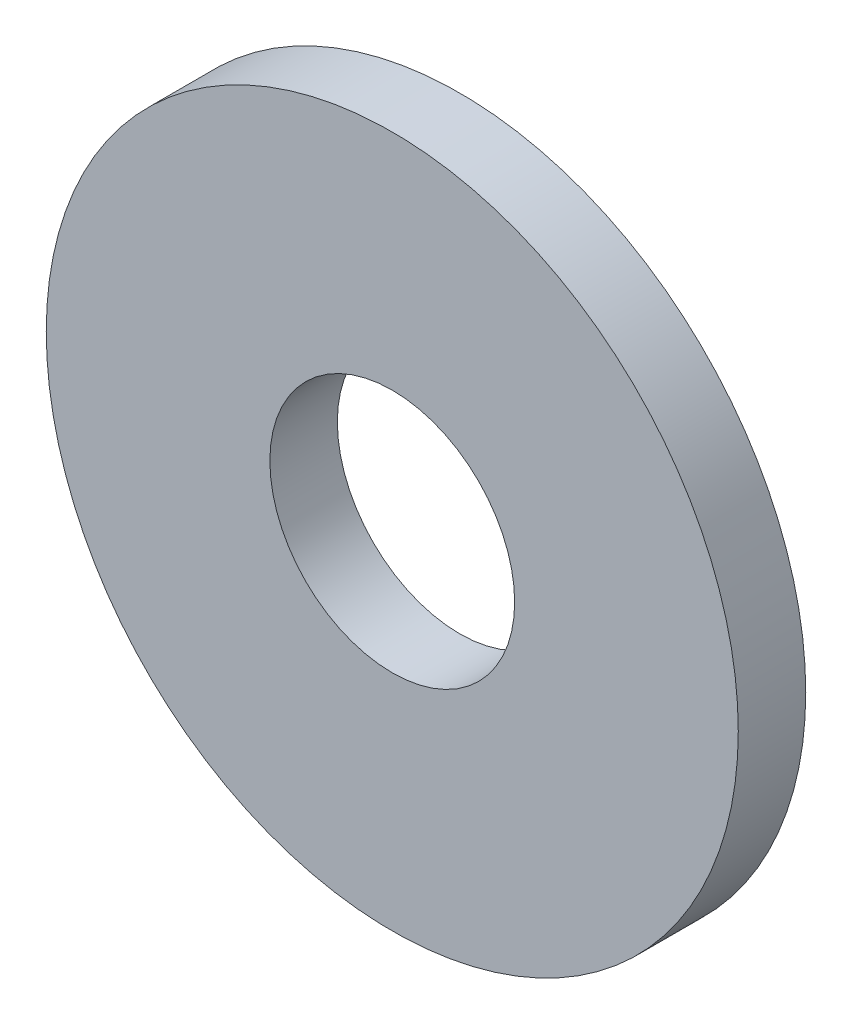
ISO-10303-21;
HEADER;
FILE_DESCRIPTION(('STEP AP214'),'2;1');
FILE_NAME('part.step','',(''),(''),'','','');
FILE_SCHEMA(('AUTOMOTIVE_DESIGN { 1 0 10303 214 1 1 1 1 }'));
ENDSEC;
DATA;
#1=APPLICATION_CONTEXT('core data for automotive mechanical design processes');
#2=APPLICATION_PROTOCOL_DEFINITION('international standard','automotive_design',2000,#1);
#3=PRODUCT_CONTEXT('',#1,'mechanical');
#4=PRODUCT('Part','Part','',(#3));
#5=PRODUCT_RELATED_PRODUCT_CATEGORY('part','',(#4));
#6=PRODUCT_DEFINITION_FORMATION('','',#4);
#7=PRODUCT_DEFINITION_CONTEXT('part definition',#1,'design');
#8=PRODUCT_DEFINITION('design','',#6,#7);
#9=PRODUCT_DEFINITION_SHAPE('','',#8);
#10=(LENGTH_UNIT() NAMED_UNIT(*) SI_UNIT(.MILLI.,.METRE.));
#11=(NAMED_UNIT(*) PLANE_ANGLE_UNIT() SI_UNIT($,.RADIAN.));
#12=(NAMED_UNIT(*) SI_UNIT($,.STERADIAN.) SOLID_ANGLE_UNIT());
#13=UNCERTAINTY_MEASURE_WITH_UNIT(LENGTH_MEASURE(1.E-05),#10,'distance_accuracy_value','');
#14=(GEOMETRIC_REPRESENTATION_CONTEXT(3) GLOBAL_UNCERTAINTY_ASSIGNED_CONTEXT((#13)) GLOBAL_UNIT_ASSIGNED_CONTEXT((#10,
#11,#12)) REPRESENTATION_CONTEXT('',''));
#15=CARTESIAN_POINT('',(0.,0.,0.));
#16=DIRECTION('',(0.,0.,1.));
#17=DIRECTION('',(1.,0.,0.));
#18=AXIS2_PLACEMENT_3D('',#15,#16,#17);
#19=CARTESIAN_POINT('',(0.,0.,0.86));
#20=DIRECTION('',(0.,0.,1.));
#21=DIRECTION('',(1.,0.,0.));
#22=AXIS2_PLACEMENT_3D('',#19,#20,#21);
#23=PLANE('',#22);
#24=CARTESIAN_POINT('',(0.,0.,0.86));
#25=DIRECTION('',(0.,0.,1.));
#26=DIRECTION('',(1.,0.,0.));
#27=AXIS2_PLACEMENT_3D('',#24,#25,#26);
#28=CIRCLE('',#27,4.41);
#29=CARTESIAN_POINT('',(4.41,0.,0.86));
#30=VERTEX_POINT('',#29);
#31=EDGE_CURVE('E10',#30,#30,#28,.T.);
#32=ORIENTED_EDGE('',*,*,#31,.T.);
#33=EDGE_LOOP('',(#32));
#34=FACE_BOUND('',#33,.T.);
#35=CARTESIAN_POINT('',(0.,0.,0.86));
#36=DIRECTION('',(0.,0.,1.));
#37=DIRECTION('',(1.,0.,0.));
#38=AXIS2_PLACEMENT_3D('',#35,#36,#37);
#39=CIRCLE('',#38,1.56);
#40=CARTESIAN_POINT('',(1.56,0.,0.86));
#41=VERTEX_POINT('',#40);
#42=EDGE_CURVE('E41',#41,#41,#39,.T.);
#43=ORIENTED_EDGE('',*,*,#42,.F.);
#44=EDGE_LOOP('',(#43));
#45=FACE_BOUND('',#44,.T.);
#46=ADVANCED_FACE('F30',(#34,#45),#23,.T.);
#47=CARTESIAN_POINT('',(0.,0.,0.));
#48=DIRECTION('',(0.,0.,1.));
#49=DIRECTION('',(1.,0.,0.));
#50=AXIS2_PLACEMENT_3D('',#47,#48,#49);
#51=PLANE('',#50);
#52=CARTESIAN_POINT('',(0.,0.,0.));
#53=DIRECTION('',(0.,0.,1.));
#54=DIRECTION('',(1.,0.,0.));
#55=AXIS2_PLACEMENT_3D('',#52,#53,#54);
#56=CIRCLE('',#55,4.41);
#57=CARTESIAN_POINT('',(4.41,0.,0.));
#58=VERTEX_POINT('',#57);
#59=EDGE_CURVE('E34',#58,#58,#56,.T.);
#60=ORIENTED_EDGE('',*,*,#59,.F.);
#61=EDGE_LOOP('',(#60));
#62=FACE_BOUND('',#61,.T.);
#63=CARTESIAN_POINT('',(0.,0.,0.));
#64=DIRECTION('',(0.,0.,1.));
#65=DIRECTION('',(1.,0.,0.));
#66=AXIS2_PLACEMENT_3D('',#63,#64,#65);
#67=CIRCLE('',#66,1.56);
#68=CARTESIAN_POINT('',(1.56,0.,0.));
#69=VERTEX_POINT('',#68);
#70=EDGE_CURVE('E43',#69,#69,#67,.T.);
#71=ORIENTED_EDGE('',*,*,#70,.T.);
#72=EDGE_LOOP('',(#71));
#73=FACE_BOUND('',#72,.T.);
#74=ADVANCED_FACE('F53',(#62,#73),#51,.F.);
#75=CARTESIAN_POINT('',(0.,0.,0.86));
#76=DIRECTION('',(0.,0.,-1.));
#77=DIRECTION('',(-1.,0.,0.));
#78=AXIS2_PLACEMENT_3D('',#75,#76,#77);
#79=CYLINDRICAL_SURFACE('',#78,4.41);
#80=ORIENTED_EDGE('',*,*,#31,.F.);
#81=EDGE_LOOP('',(#80));
#82=FACE_BOUND('',#81,.T.);
#83=ORIENTED_EDGE('',*,*,#59,.T.);
#84=EDGE_LOOP('',(#83));
#85=FACE_BOUND('',#84,.T.);
#86=ADVANCED_FACE('F32',(#82,#85),#79,.T.);
#87=CARTESIAN_POINT('',(0.,0.,0.86));
#88=DIRECTION('',(0.,0.,-1.));
#89=DIRECTION('',(-1.,0.,0.));
#90=AXIS2_PLACEMENT_3D('',#87,#88,#89);
#91=CYLINDRICAL_SURFACE('',#90,1.56);
#92=ORIENTED_EDGE('',*,*,#42,.T.);
#93=EDGE_LOOP('',(#92));
#94=FACE_BOUND('',#93,.T.);
#95=ORIENTED_EDGE('',*,*,#70,.F.);
#96=EDGE_LOOP('',(#95));
#97=FACE_BOUND('',#96,.T.);
#98=ADVANCED_FACE('F49',(#94,#97),#91,.F.);
#99=CLOSED_SHELL('',(#46,#74,#86,#98));
#100=MANIFOLD_SOLID_BREP('B2',#99);
#101=ADVANCED_BREP_SHAPE_REPRESENTATION('',(#18,#100),#14);
#102=SHAPE_DEFINITION_REPRESENTATION(#9,#101);
ENDSEC;
END-ISO-10303-21;
